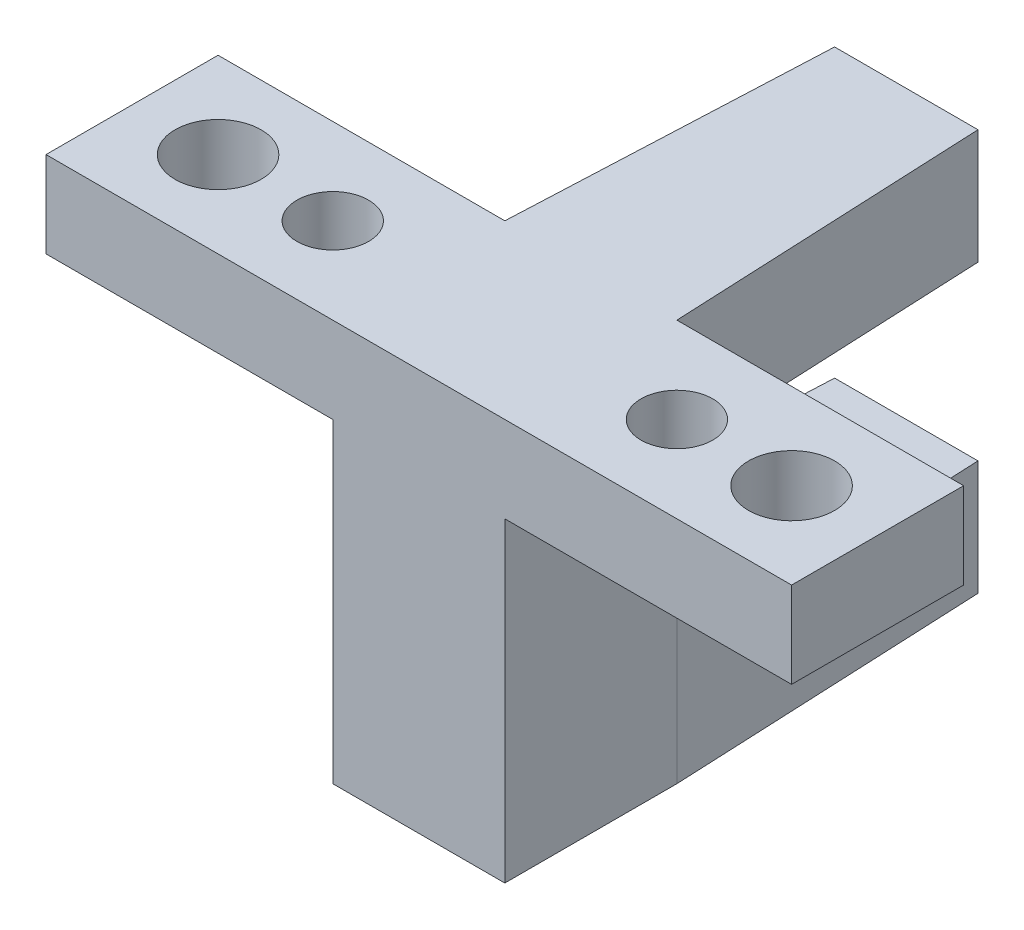
ISO-10303-21;
HEADER;
FILE_DESCRIPTION(('STEP AP214'),'2;1');
FILE_NAME('part.step','',(''),(''),'','','');
FILE_SCHEMA(('AUTOMOTIVE_DESIGN { 1 0 10303 214 1 1 1 1 }'));
ENDSEC;
DATA;
#1=APPLICATION_CONTEXT('core data for automotive mechanical design processes');
#2=APPLICATION_PROTOCOL_DEFINITION('international standard','automotive_design',2000,#1);
#3=PRODUCT_CONTEXT('',#1,'mechanical');
#4=PRODUCT('Part','Part','',(#3));
#5=PRODUCT_RELATED_PRODUCT_CATEGORY('part','',(#4));
#6=PRODUCT_DEFINITION_FORMATION('','',#4);
#7=PRODUCT_DEFINITION_CONTEXT('part definition',#1,'design');
#8=PRODUCT_DEFINITION('design','',#6,#7);
#9=PRODUCT_DEFINITION_SHAPE('','',#8);
#10=(LENGTH_UNIT() NAMED_UNIT(*) SI_UNIT(.MILLI.,.METRE.));
#11=(NAMED_UNIT(*) PLANE_ANGLE_UNIT() SI_UNIT($,.RADIAN.));
#12=(NAMED_UNIT(*) SI_UNIT($,.STERADIAN.) SOLID_ANGLE_UNIT());
#13=UNCERTAINTY_MEASURE_WITH_UNIT(LENGTH_MEASURE(1.E-05),#10,'distance_accuracy_value','');
#14=(GEOMETRIC_REPRESENTATION_CONTEXT(3) GLOBAL_UNCERTAINTY_ASSIGNED_CONTEXT((#13)) GLOBAL_UNIT_ASSIGNED_CONTEXT((#10,
#11,#12)) REPRESENTATION_CONTEXT('',''));
#15=CARTESIAN_POINT('',(0.,0.,0.));
#16=DIRECTION('',(0.,0.,1.));
#17=DIRECTION('',(1.,0.,0.));
#18=AXIS2_PLACEMENT_3D('',#15,#16,#17);
#19=CARTESIAN_POINT('',(0.,0.,0.));
#20=DIRECTION('',(0.,1.,0.));
#21=DIRECTION('',(0.,0.,1.));
#22=AXIS2_PLACEMENT_3D('',#19,#20,#21);
#23=PLANE('',#22);
#24=CARTESIAN_POINT('',(-6.,0.,0.));
#25=DIRECTION('',(0.,1.,0.));
#26=DIRECTION('',(0.,0.,1.));
#27=AXIS2_PLACEMENT_3D('',#24,#25,#26);
#28=CIRCLE('',#27,1.25);
#29=CARTESIAN_POINT('',(-6.,0.,1.25));
#30=VERTEX_POINT('',#29);
#31=EDGE_CURVE('E251',#30,#30,#28,.T.);
#32=ORIENTED_EDGE('',*,*,#31,.T.);
#33=EDGE_LOOP('',(#32));
#34=FACE_BOUND('',#33,.T.);
#35=CARTESIAN_POINT('',(-10.,0.,0.));
#36=DIRECTION('',(0.,1.,0.));
#37=DIRECTION('',(0.,0.,1.));
#38=AXIS2_PLACEMENT_3D('',#35,#36,#37);
#39=CIRCLE('',#38,1.5);
#40=CARTESIAN_POINT('',(-10.,0.,1.5));
#41=VERTEX_POINT('',#40);
#42=EDGE_CURVE('E257',#41,#41,#39,.T.);
#43=ORIENTED_EDGE('',*,*,#42,.T.);
#44=EDGE_LOOP('',(#43));
#45=FACE_BOUND('',#44,.T.);
#46=DIRECTION('',(0.,0.,-1.));
#47=VECTOR('',#46,1.);
#48=CARTESIAN_POINT('',(-3.,0.,0.));
#49=LINE('',#48,#47);
#50=CARTESIAN_POINT('',(-3.,0.,3.));
#51=VERTEX_POINT('',#50);
#52=CARTESIAN_POINT('',(-3.,0.,-3.));
#53=VERTEX_POINT('',#52);
#54=EDGE_CURVE('E196',#51,#53,#49,.T.);
#55=ORIENTED_EDGE('',*,*,#54,.F.);
#56=DIRECTION('',(1.,0.,0.));
#57=VECTOR('',#56,1.);
#58=CARTESIAN_POINT('',(-13.,0.,3.));
#59=LINE('',#58,#57);
#60=CARTESIAN_POINT('',(-13.,0.,3.));
#61=VERTEX_POINT('',#60);
#62=EDGE_CURVE('E269',#61,#51,#59,.T.);
#63=ORIENTED_EDGE('',*,*,#62,.F.);
#64=DIRECTION('',(0.,0.,1.));
#65=VECTOR('',#64,1.);
#66=CARTESIAN_POINT('',(-13.,0.,-3.));
#67=LINE('',#66,#65);
#68=CARTESIAN_POINT('',(-13.,0.,-3.));
#69=VERTEX_POINT('',#68);
#70=EDGE_CURVE('E281',#69,#61,#67,.T.);
#71=ORIENTED_EDGE('',*,*,#70,.F.);
#72=DIRECTION('',(-1.,0.,0.));
#73=VECTOR('',#72,1.);
#74=CARTESIAN_POINT('',(-13.,0.,-3.));
#75=LINE('',#74,#73);
#76=EDGE_CURVE('E277',#53,#69,#75,.T.);
#77=ORIENTED_EDGE('',*,*,#76,.F.);
#78=EDGE_LOOP('',(#55,#63,#71,#77));
#79=FACE_BOUND('',#78,.T.);
#80=ADVANCED_FACE('F42',(#34,#45,#79),#23,.F.);
#81=CARTESIAN_POINT('',(0.,-1.,0.));
#82=DIRECTION('',(0.,1.,0.));
#83=DIRECTION('',(0.,0.,1.));
#84=AXIS2_PLACEMENT_3D('',#81,#82,#83);
#85=PLANE('',#84);
#86=DIRECTION('',(1.,0.,0.));
#87=VECTOR('',#86,1.);
#88=CARTESIAN_POINT('',(0.,-1.,-7.));
#89=LINE('',#88,#87);
#90=CARTESIAN_POINT('',(-2.81818181818182,-1.,-7.));
#91=VERTEX_POINT('',#90);
#92=CARTESIAN_POINT('',(2.81818181818182,-1.,-7.));
#93=VERTEX_POINT('',#92);
#94=EDGE_CURVE('E11',#91,#93,#89,.T.);
#95=ORIENTED_EDGE('',*,*,#94,.F.);
#96=DIRECTION('',(-0.0454076609186497,0.,0.9989685402103));
#97=VECTOR('',#96,1.);
#98=CARTESIAN_POINT('',(-3.12989690721649,-1.,-0.142268041237112));
#99=LINE('',#98,#97);
#100=CARTESIAN_POINT('',(-2.5,-1.,-14.));
#101=VERTEX_POINT('',#100);
#102=EDGE_CURVE('E220',#101,#91,#99,.T.);
#103=ORIENTED_EDGE('',*,*,#102,.F.);
#104=DIRECTION('',(1.,0.,0.));
#105=VECTOR('',#104,1.);
#106=CARTESIAN_POINT('',(0.,-1.,-14.));
#107=LINE('',#106,#105);
#108=CARTESIAN_POINT('',(2.5,-1.,-14.));
#109=VERTEX_POINT('',#108);
#110=EDGE_CURVE('E217',#101,#109,#107,.T.);
#111=ORIENTED_EDGE('',*,*,#110,.T.);
#112=DIRECTION('',(0.04540766091865,0.,0.9989685402103));
#113=VECTOR('',#112,1.);
#114=CARTESIAN_POINT('',(3.1298969072165,-1.,-0.142268041237114));
#115=LINE('',#114,#113);
#116=EDGE_CURVE('E222',#109,#93,#115,.T.);
#117=ORIENTED_EDGE('',*,*,#116,.T.);
#118=EDGE_LOOP('',(#95,#103,#111,#117));
#119=FACE_BOUND('',#118,.T.);
#120=ADVANCED_FACE('F321',(#119),#85,.F.);
#121=CARTESIAN_POINT('',(-13.,3.,-3.));
#122=DIRECTION('',(0.,0.,1.));
#123=DIRECTION('',(1.,0.,0.));
#124=AXIS2_PLACEMENT_3D('',#121,#122,#123);
#125=PLANE('',#124);
#126=DIRECTION('',(0.,1.,0.));
#127=VECTOR('',#126,1.);
#128=CARTESIAN_POINT('',(-3.,-1.,-3.));
#129=LINE('',#128,#127);
#130=CARTESIAN_POINT('',(-3.,3.,-3.));
#131=VERTEX_POINT('',#130);
#132=EDGE_CURVE('E50',#53,#131,#129,.T.);
#133=ORIENTED_EDGE('',*,*,#132,.F.);
#134=ORIENTED_EDGE('',*,*,#76,.T.);
#135=DIRECTION('',(0.,-1.,0.));
#136=VECTOR('',#135,1.);
#137=CARTESIAN_POINT('',(-13.,3.,-3.));
#138=LINE('',#137,#136);
#139=CARTESIAN_POINT('',(-13.,3.,-3.));
#140=VERTEX_POINT('',#139);
#141=EDGE_CURVE('E289',#140,#69,#138,.T.);
#142=ORIENTED_EDGE('',*,*,#141,.F.);
#143=DIRECTION('',(-1.,0.,0.));
#144=VECTOR('',#143,1.);
#145=CARTESIAN_POINT('',(-13.,3.,-3.));
#146=LINE('',#145,#144);
#147=EDGE_CURVE('E268',#131,#140,#146,.T.);
#148=ORIENTED_EDGE('',*,*,#147,.F.);
#149=EDGE_LOOP('',(#133,#134,#142,#148));
#150=FACE_BOUND('',#149,.T.);
#151=ADVANCED_FACE('F302',(#150),#125,.F.);
#152=CARTESIAN_POINT('',(0.,3.,0.));
#153=DIRECTION('',(0.,1.,0.));
#154=DIRECTION('',(0.,0.,1.));
#155=AXIS2_PLACEMENT_3D('',#152,#153,#154);
#156=PLANE('',#155);
#157=CARTESIAN_POINT('',(10.,3.,0.));
#158=DIRECTION('',(0.,1.,0.));
#159=DIRECTION('',(0.,0.,1.));
#160=AXIS2_PLACEMENT_3D('',#157,#158,#159);
#161=CIRCLE('',#160,1.5);
#162=CARTESIAN_POINT('',(10.,3.,1.5));
#163=VERTEX_POINT('',#162);
#164=EDGE_CURVE('E248',#163,#163,#161,.T.);
#165=ORIENTED_EDGE('',*,*,#164,.F.);
#166=EDGE_LOOP('',(#165));
#167=FACE_BOUND('',#166,.T.);
#168=CARTESIAN_POINT('',(-10.,3.,0.));
#169=DIRECTION('',(0.,1.,0.));
#170=DIRECTION('',(0.,0.,1.));
#171=AXIS2_PLACEMENT_3D('',#168,#169,#170);
#172=CIRCLE('',#171,1.5);
#173=CARTESIAN_POINT('',(-10.,3.,1.5));
#174=VERTEX_POINT('',#173);
#175=EDGE_CURVE('E260',#174,#174,#172,.T.);
#176=ORIENTED_EDGE('',*,*,#175,.F.);
#177=EDGE_LOOP('',(#176));
#178=FACE_BOUND('',#177,.T.);
#179=DIRECTION('',(0.,0.,-1.));
#180=VECTOR('',#179,1.);
#181=CARTESIAN_POINT('',(13.,3.,-3.));
#182=LINE('',#181,#180);
#183=CARTESIAN_POINT('',(13.,3.,3.00000000000001));
#184=VERTEX_POINT('',#183);
#185=CARTESIAN_POINT('',(13.,3.,-3.));
#186=VERTEX_POINT('',#185);
#187=EDGE_CURVE('E266',#184,#186,#182,.T.);
#188=ORIENTED_EDGE('',*,*,#187,.T.);
#189=CARTESIAN_POINT('',(3.,3.,-3.));
#190=VERTEX_POINT('',#189);
#191=EDGE_CURVE('E94',#186,#190,#146,.T.);
#192=ORIENTED_EDGE('',*,*,#191,.T.);
#193=DIRECTION('',(0.04540766091865,0.,0.9989685402103));
#194=VECTOR('',#193,1.);
#195=CARTESIAN_POINT('',(3.1298969072165,3.,-0.142268041237114));
#196=LINE('',#195,#194);
#197=CARTESIAN_POINT('',(2.5,3.,-14.));
#198=VERTEX_POINT('',#197);
#199=EDGE_CURVE('E57',#198,#190,#196,.T.);
#200=ORIENTED_EDGE('',*,*,#199,.F.);
#201=DIRECTION('',(1.,0.,0.));
#202=VECTOR('',#201,1.);
#203=CARTESIAN_POINT('',(0.,3.,-14.));
#204=LINE('',#203,#202);
#205=CARTESIAN_POINT('',(-2.5,3.,-14.));
#206=VERTEX_POINT('',#205);
#207=EDGE_CURVE('E216',#206,#198,#204,.T.);
#208=ORIENTED_EDGE('',*,*,#207,.F.);
#209=DIRECTION('',(-0.0454076609186497,0.,0.9989685402103));
#210=VECTOR('',#209,1.);
#211=CARTESIAN_POINT('',(-3.12989690721649,3.,-0.142268041237112));
#212=LINE('',#211,#210);
#213=EDGE_CURVE('E228',#206,#131,#212,.T.);
#214=ORIENTED_EDGE('',*,*,#213,.T.);
#215=ORIENTED_EDGE('',*,*,#147,.T.);
#216=DIRECTION('',(0.,0.,1.));
#217=VECTOR('',#216,1.);
#218=CARTESIAN_POINT('',(-13.,3.,-3.));
#219=LINE('',#218,#217);
#220=CARTESIAN_POINT('',(-13.,3.,3.));
#221=VERTEX_POINT('',#220);
#222=EDGE_CURVE('E271',#140,#221,#219,.T.);
#223=ORIENTED_EDGE('',*,*,#222,.T.);
#224=DIRECTION('',(1.,0.,0.));
#225=VECTOR('',#224,1.);
#226=CARTESIAN_POINT('',(-13.,3.,3.));
#227=LINE('',#226,#225);
#228=EDGE_CURVE('E66',#221,#184,#227,.T.);
#229=ORIENTED_EDGE('',*,*,#228,.T.);
#230=EDGE_LOOP('',(#188,#192,#200,#208,#214,#215,#223,#229));
#231=FACE_BOUND('',#230,.T.);
#232=CARTESIAN_POINT('',(-6.,3.,0.));
#233=DIRECTION('',(0.,1.,0.));
#234=DIRECTION('',(0.,0.,1.));
#235=AXIS2_PLACEMENT_3D('',#232,#233,#234);
#236=CIRCLE('',#235,1.25);
#237=CARTESIAN_POINT('',(-6.,3.,1.25));
#238=VERTEX_POINT('',#237);
#239=EDGE_CURVE('E254',#238,#238,#236,.T.);
#240=ORIENTED_EDGE('',*,*,#239,.F.);
#241=EDGE_LOOP('',(#240));
#242=FACE_BOUND('',#241,.T.);
#243=CARTESIAN_POINT('',(6.,3.,0.));
#244=DIRECTION('',(0.,1.,0.));
#245=DIRECTION('',(0.,0.,1.));
#246=AXIS2_PLACEMENT_3D('',#243,#244,#245);
#247=CIRCLE('',#246,1.25);
#248=CARTESIAN_POINT('',(6.,3.,1.25));
#249=VERTEX_POINT('',#248);
#250=EDGE_CURVE('E242',#249,#249,#247,.T.);
#251=ORIENTED_EDGE('',*,*,#250,.F.);
#252=EDGE_LOOP('',(#251));
#253=FACE_BOUND('',#252,.T.);
#254=ADVANCED_FACE('F299',(#167,#178,#231,#242,#253),#156,.T.);
#255=CARTESIAN_POINT('',(3.,0.,3.));
#256=VERTEX_POINT('',#255);
#257=CARTESIAN_POINT('',(13.,0.,3.00000000000001));
#258=VERTEX_POINT('',#257);
#259=EDGE_CURVE('E87',#256,#258,#59,.T.);
#260=ORIENTED_EDGE('',*,*,#259,.F.);
#261=DIRECTION('',(0.,0.,-1.));
#262=VECTOR('',#261,1.);
#263=CARTESIAN_POINT('',(3.,0.,0.));
#264=LINE('',#263,#262);
#265=CARTESIAN_POINT('',(3.,0.,-3.));
#266=VERTEX_POINT('',#265);
#267=EDGE_CURVE('E190',#256,#266,#264,.T.);
#268=ORIENTED_EDGE('',*,*,#267,.T.);
#269=CARTESIAN_POINT('',(13.,0.,-3.));
#270=VERTEX_POINT('',#269);
#271=EDGE_CURVE('E278',#270,#266,#75,.T.);
#272=ORIENTED_EDGE('',*,*,#271,.F.);
#273=DIRECTION('',(0.,0.,-1.));
#274=VECTOR('',#273,1.);
#275=CARTESIAN_POINT('',(13.,0.,-3.));
#276=LINE('',#275,#274);
#277=EDGE_CURVE('E263',#258,#270,#276,.T.);
#278=ORIENTED_EDGE('',*,*,#277,.F.);
#279=EDGE_LOOP('',(#260,#268,#272,#278));
#280=FACE_BOUND('',#279,.T.);
#281=CARTESIAN_POINT('',(10.,0.,0.));
#282=DIRECTION('',(0.,1.,0.));
#283=DIRECTION('',(0.,0.,1.));
#284=AXIS2_PLACEMENT_3D('',#281,#282,#283);
#285=CIRCLE('',#284,1.5);
#286=CARTESIAN_POINT('',(10.,0.,1.5));
#287=VERTEX_POINT('',#286);
#288=EDGE_CURVE('E245',#287,#287,#285,.T.);
#289=ORIENTED_EDGE('',*,*,#288,.T.);
#290=EDGE_LOOP('',(#289));
#291=FACE_BOUND('',#290,.T.);
#292=CARTESIAN_POINT('',(6.,0.,0.));
#293=DIRECTION('',(0.,1.,0.));
#294=DIRECTION('',(0.,0.,1.));
#295=AXIS2_PLACEMENT_3D('',#292,#293,#294);
#296=CIRCLE('',#295,1.25);
#297=CARTESIAN_POINT('',(6.,0.,1.25));
#298=VERTEX_POINT('',#297);
#299=EDGE_CURVE('E234',#298,#298,#296,.T.);
#300=ORIENTED_EDGE('',*,*,#299,.T.);
#301=EDGE_LOOP('',(#300));
#302=FACE_BOUND('',#301,.T.);
#303=ADVANCED_FACE('F339',(#280,#291,#302),#23,.F.);
#304=CARTESIAN_POINT('',(13.,3.,-3.));
#305=DIRECTION('',(-1.,0.,0.));
#306=DIRECTION('',(0.,0.,1.));
#307=AXIS2_PLACEMENT_3D('',#304,#305,#306);
#308=PLANE('',#307);
#309=ORIENTED_EDGE('',*,*,#277,.T.);
#310=DIRECTION('',(0.,-1.,0.));
#311=VECTOR('',#310,1.);
#312=CARTESIAN_POINT('',(13.,3.,-3.));
#313=LINE('',#312,#311);
#314=EDGE_CURVE('E291',#186,#270,#313,.T.);
#315=ORIENTED_EDGE('',*,*,#314,.F.);
#316=ORIENTED_EDGE('',*,*,#187,.F.);
#317=DIRECTION('',(0.,-1.,0.));
#318=VECTOR('',#317,1.);
#319=CARTESIAN_POINT('',(13.,3.,3.00000000000001));
#320=LINE('',#319,#318);
#321=EDGE_CURVE('E274',#184,#258,#320,.T.);
#322=ORIENTED_EDGE('',*,*,#321,.T.);
#323=EDGE_LOOP('',(#309,#315,#316,#322));
#324=FACE_BOUND('',#323,.T.);
#325=ADVANCED_FACE('F44',(#324),#308,.F.);
#326=ORIENTED_EDGE('',*,*,#271,.T.);
#327=DIRECTION('',(0.,1.,0.));
#328=VECTOR('',#327,1.);
#329=CARTESIAN_POINT('',(3.,-1.,-3.));
#330=LINE('',#329,#328);
#331=EDGE_CURVE('E238',#266,#190,#330,.T.);
#332=ORIENTED_EDGE('',*,*,#331,.T.);
#333=ORIENTED_EDGE('',*,*,#191,.F.);
#334=ORIENTED_EDGE('',*,*,#314,.T.);
#335=EDGE_LOOP('',(#326,#332,#333,#334));
#336=FACE_BOUND('',#335,.T.);
#337=ADVANCED_FACE('F341',(#336),#125,.F.);
#338=CARTESIAN_POINT('',(-13.,3.,-3.));
#339=DIRECTION('',(1.,0.,0.));
#340=DIRECTION('',(0.,0.,-1.));
#341=AXIS2_PLACEMENT_3D('',#338,#339,#340);
#342=PLANE('',#341);
#343=ORIENTED_EDGE('',*,*,#70,.T.);
#344=DIRECTION('',(0.,-1.,0.));
#345=VECTOR('',#344,1.);
#346=CARTESIAN_POINT('',(-13.,3.,3.));
#347=LINE('',#346,#345);
#348=EDGE_CURVE('E286',#221,#61,#347,.T.);
#349=ORIENTED_EDGE('',*,*,#348,.F.);
#350=ORIENTED_EDGE('',*,*,#222,.F.);
#351=ORIENTED_EDGE('',*,*,#141,.T.);
#352=EDGE_LOOP('',(#343,#349,#350,#351));
#353=FACE_BOUND('',#352,.T.);
#354=ADVANCED_FACE('F307',(#353),#342,.F.);
#355=CARTESIAN_POINT('',(-13.,3.,3.));
#356=DIRECTION('',(0.,0.,-1.));
#357=DIRECTION('',(-1.,0.,0.));
#358=AXIS2_PLACEMENT_3D('',#355,#356,#357);
#359=PLANE('',#358);
#360=ORIENTED_EDGE('',*,*,#62,.T.);
#361=DIRECTION('',(0.,1.,0.));
#362=VECTOR('',#361,1.);
#363=CARTESIAN_POINT('',(-3.,-11.,3.));
#364=LINE('',#363,#362);
#365=CARTESIAN_POINT('',(-3.,-11.,3.));
#366=VERTEX_POINT('',#365);
#367=EDGE_CURVE('E210',#366,#51,#364,.T.);
#368=ORIENTED_EDGE('',*,*,#367,.F.);
#369=DIRECTION('',(-1.,0.,0.));
#370=VECTOR('',#369,1.);
#371=CARTESIAN_POINT('',(0.,-11.,3.));
#372=LINE('',#371,#370);
#373=CARTESIAN_POINT('',(3.,-11.,3.));
#374=VERTEX_POINT('',#373);
#375=EDGE_CURVE('E199',#374,#366,#372,.T.);
#376=ORIENTED_EDGE('',*,*,#375,.F.);
#377=DIRECTION('',(0.,1.,0.));
#378=VECTOR('',#377,1.);
#379=CARTESIAN_POINT('',(3.,-11.,3.));
#380=LINE('',#379,#378);
#381=EDGE_CURVE('E212',#374,#256,#380,.T.);
#382=ORIENTED_EDGE('',*,*,#381,.T.);
#383=ORIENTED_EDGE('',*,*,#259,.T.);
#384=ORIENTED_EDGE('',*,*,#321,.F.);
#385=ORIENTED_EDGE('',*,*,#228,.F.);
#386=ORIENTED_EDGE('',*,*,#348,.T.);
#387=EDGE_LOOP('',(#360,#368,#376,#382,#383,#384,#385,#386));
#388=FACE_BOUND('',#387,.T.);
#389=ADVANCED_FACE('F309',(#388),#359,.F.);
#390=CARTESIAN_POINT('',(-10.,3.,0.));
#391=DIRECTION('',(0.,-1.,0.));
#392=DIRECTION('',(0.,0.,-1.));
#393=AXIS2_PLACEMENT_3D('',#390,#391,#392);
#394=CYLINDRICAL_SURFACE('',#393,1.5);
#395=ORIENTED_EDGE('',*,*,#175,.T.);
#396=EDGE_LOOP('',(#395));
#397=FACE_BOUND('',#396,.T.);
#398=ORIENTED_EDGE('',*,*,#42,.F.);
#399=EDGE_LOOP('',(#398));
#400=FACE_BOUND('',#399,.T.);
#401=ADVANCED_FACE('F369',(#397,#400),#394,.F.);
#402=CARTESIAN_POINT('',(-6.,3.,0.));
#403=DIRECTION('',(0.,-1.,0.));
#404=DIRECTION('',(0.,0.,-1.));
#405=AXIS2_PLACEMENT_3D('',#402,#403,#404);
#406=CYLINDRICAL_SURFACE('',#405,1.25);
#407=ORIENTED_EDGE('',*,*,#239,.T.);
#408=EDGE_LOOP('',(#407));
#409=FACE_BOUND('',#408,.T.);
#410=ORIENTED_EDGE('',*,*,#31,.F.);
#411=EDGE_LOOP('',(#410));
#412=FACE_BOUND('',#411,.T.);
#413=ADVANCED_FACE('F372',(#409,#412),#406,.F.);
#414=CARTESIAN_POINT('',(10.,3.,0.));
#415=DIRECTION('',(0.,-1.,0.));
#416=DIRECTION('',(0.,0.,-1.));
#417=AXIS2_PLACEMENT_3D('',#414,#415,#416);
#418=CYLINDRICAL_SURFACE('',#417,1.5);
#419=ORIENTED_EDGE('',*,*,#164,.T.);
#420=EDGE_LOOP('',(#419));
#421=FACE_BOUND('',#420,.T.);
#422=ORIENTED_EDGE('',*,*,#288,.F.);
#423=EDGE_LOOP('',(#422));
#424=FACE_BOUND('',#423,.T.);
#425=ADVANCED_FACE('F376',(#421,#424),#418,.F.);
#426=CARTESIAN_POINT('',(6.,3.,0.));
#427=DIRECTION('',(0.,-1.,0.));
#428=DIRECTION('',(0.,0.,-1.));
#429=AXIS2_PLACEMENT_3D('',#426,#427,#428);
#430=CYLINDRICAL_SURFACE('',#429,1.25);
#431=ORIENTED_EDGE('',*,*,#250,.T.);
#432=EDGE_LOOP('',(#431));
#433=FACE_BOUND('',#432,.T.);
#434=ORIENTED_EDGE('',*,*,#299,.F.);
#435=EDGE_LOOP('',(#434));
#436=FACE_BOUND('',#435,.T.);
#437=ADVANCED_FACE('F380',(#433,#436),#430,.F.);
#438=CARTESIAN_POINT('',(0.,-1.,-14.));
#439=DIRECTION('',(0.,0.,1.));
#440=DIRECTION('',(1.,0.,0.));
#441=AXIS2_PLACEMENT_3D('',#438,#439,#440);
#442=PLANE('',#441);
#443=ORIENTED_EDGE('',*,*,#207,.T.);
#444=DIRECTION('',(0.,1.,0.));
#445=VECTOR('',#444,1.);
#446=CARTESIAN_POINT('',(2.5,-1.,-14.));
#447=LINE('',#446,#445);
#448=EDGE_CURVE('E232',#109,#198,#447,.T.);
#449=ORIENTED_EDGE('',*,*,#448,.F.);
#450=ORIENTED_EDGE('',*,*,#110,.F.);
#451=DIRECTION('',(0.,1.,0.));
#452=VECTOR('',#451,1.);
#453=CARTESIAN_POINT('',(-2.5,-1.,-14.));
#454=LINE('',#453,#452);
#455=EDGE_CURVE('E225',#101,#206,#454,.T.);
#456=ORIENTED_EDGE('',*,*,#455,.T.);
#457=EDGE_LOOP('',(#443,#449,#450,#456));
#458=FACE_BOUND('',#457,.T.);
#459=ADVANCED_FACE('F317',(#458),#442,.F.);
#460=CARTESIAN_POINT('',(3.1298969072165,-1.,-0.142268041237114));
#461=DIRECTION('',(-0.998968540210299,0.,0.04540766091865));
#462=DIRECTION('',(0.04540766091865,0.,0.9989685402103));
#463=AXIS2_PLACEMENT_3D('',#460,#461,#462);
#464=PLANE('',#463);
#465=CARTESIAN_POINT('',(3.,-11.,-3.));
#466=VERTEX_POINT('',#465);
#467=EDGE_CURVE('E235',#466,#266,#330,.T.);
#468=ORIENTED_EDGE('',*,*,#467,.F.);
#469=DIRECTION('',(0.0454076609186497,0.,0.9989685402103));
#470=VECTOR('',#469,1.);
#471=CARTESIAN_POINT('',(3.12989690721649,-11.,-0.142268041237112));
#472=LINE('',#471,#470);
#473=CARTESIAN_POINT('',(2.5,-11.,-14.));
#474=VERTEX_POINT('',#473);
#475=EDGE_CURVE('E192',#474,#466,#472,.T.);
#476=ORIENTED_EDGE('',*,*,#475,.F.);
#477=DIRECTION('',(0.,-1.,0.));
#478=VECTOR('',#477,1.);
#479=CARTESIAN_POINT('',(2.5,-7.,-14.));
#480=LINE('',#479,#478);
#481=CARTESIAN_POINT('',(2.5,-7.,-14.));
#482=VERTEX_POINT('',#481);
#483=EDGE_CURVE('E170',#482,#474,#480,.T.);
#484=ORIENTED_EDGE('',*,*,#483,.F.);
#485=DIRECTION('',(0.04540766091865,0.,0.9989685402103));
#486=VECTOR('',#485,1.);
#487=CARTESIAN_POINT('',(2.5,-7.,-14.));
#488=LINE('',#487,#486);
#489=CARTESIAN_POINT('',(2.81818181818182,-7.,-7.));
#490=VERTEX_POINT('',#489);
#491=EDGE_CURVE('E179',#482,#490,#488,.T.);
#492=ORIENTED_EDGE('',*,*,#491,.T.);
#493=DIRECTION('',(0.,1.,0.));
#494=VECTOR('',#493,1.);
#495=CARTESIAN_POINT('',(2.81818181818182,-11.,-7.));
#496=LINE('',#495,#494);
#497=EDGE_CURVE('E214',#490,#93,#496,.T.);
#498=ORIENTED_EDGE('',*,*,#497,.T.);
#499=ORIENTED_EDGE('',*,*,#116,.F.);
#500=ORIENTED_EDGE('',*,*,#448,.T.);
#501=ORIENTED_EDGE('',*,*,#199,.T.);
#502=ORIENTED_EDGE('',*,*,#331,.F.);
#503=EDGE_LOOP('',(#468,#476,#484,#492,#498,#499,#500,#501,#502));
#504=FACE_BOUND('',#503,.T.);
#505=ADVANCED_FACE('F314',(#504),#464,.F.);
#506=CARTESIAN_POINT('',(-3.12989690721649,-1.,-0.142268041237112));
#507=DIRECTION('',(-0.9989685402103,0.,-0.0454076609186497));
#508=DIRECTION('',(-0.0454076609186497,0.,0.9989685402103));
#509=AXIS2_PLACEMENT_3D('',#506,#507,#508);
#510=PLANE('',#509);
#511=ORIENTED_EDGE('',*,*,#102,.T.);
#512=DIRECTION('',(0.,1.,0.));
#513=VECTOR('',#512,1.);
#514=CARTESIAN_POINT('',(-2.81818181818182,-11.,-7.));
#515=LINE('',#514,#513);
#516=CARTESIAN_POINT('',(-2.81818181818182,-7.,-7.));
#517=VERTEX_POINT('',#516);
#518=EDGE_CURVE('E184',#517,#91,#515,.T.);
#519=ORIENTED_EDGE('',*,*,#518,.F.);
#520=DIRECTION('',(0.0454076609186497,0.,-0.9989685402103));
#521=VECTOR('',#520,1.);
#522=CARTESIAN_POINT('',(-2.5,-7.,-14.));
#523=LINE('',#522,#521);
#524=CARTESIAN_POINT('',(-2.5,-7.,-14.));
#525=VERTEX_POINT('',#524);
#526=EDGE_CURVE('E177',#517,#525,#523,.T.);
#527=ORIENTED_EDGE('',*,*,#526,.T.);
#528=DIRECTION('',(0.,-1.,0.));
#529=VECTOR('',#528,1.);
#530=CARTESIAN_POINT('',(-2.5,-7.,-14.));
#531=LINE('',#530,#529);
#532=CARTESIAN_POINT('',(-2.5,-11.,-14.));
#533=VERTEX_POINT('',#532);
#534=EDGE_CURVE('E160',#525,#533,#531,.T.);
#535=ORIENTED_EDGE('',*,*,#534,.T.);
#536=DIRECTION('',(-0.0454076609186507,0.,0.9989685402103));
#537=VECTOR('',#536,1.);
#538=CARTESIAN_POINT('',(-3.1298969072165,-11.,-0.142268041237116));
#539=LINE('',#538,#537);
#540=CARTESIAN_POINT('',(-3.,-11.,-3.));
#541=VERTEX_POINT('',#540);
#542=EDGE_CURVE('E204',#533,#541,#539,.T.);
#543=ORIENTED_EDGE('',*,*,#542,.T.);
#544=EDGE_CURVE('E237',#541,#53,#129,.T.);
#545=ORIENTED_EDGE('',*,*,#544,.T.);
#546=ORIENTED_EDGE('',*,*,#132,.T.);
#547=ORIENTED_EDGE('',*,*,#213,.F.);
#548=ORIENTED_EDGE('',*,*,#455,.F.);
#549=EDGE_LOOP('',(#511,#519,#527,#535,#543,#545,#546,#547,#548));
#550=FACE_BOUND('',#549,.T.);
#551=ADVANCED_FACE('F183',(#550),#510,.T.);
#552=CARTESIAN_POINT('',(0.,-11.,-7.));
#553=DIRECTION('',(0.,0.,1.));
#554=DIRECTION('',(1.,0.,0.));
#555=AXIS2_PLACEMENT_3D('',#552,#553,#554);
#556=PLANE('',#555);
#557=ORIENTED_EDGE('',*,*,#497,.F.);
#558=DIRECTION('',(-1.,0.,0.));
#559=VECTOR('',#558,1.);
#560=CARTESIAN_POINT('',(-2.81818181818182,-7.,-7.));
#561=LINE('',#560,#559);
#562=EDGE_CURVE('E171',#490,#517,#561,.T.);
#563=ORIENTED_EDGE('',*,*,#562,.T.);
#564=ORIENTED_EDGE('',*,*,#518,.T.);
#565=ORIENTED_EDGE('',*,*,#94,.T.);
#566=EDGE_LOOP('',(#557,#563,#564,#565));
#567=FACE_BOUND('',#566,.T.);
#568=ADVANCED_FACE('F324',(#567),#556,.F.);
#569=CARTESIAN_POINT('',(3.,-11.,0.));
#570=DIRECTION('',(1.,0.,0.));
#571=DIRECTION('',(0.,0.,-1.));
#572=AXIS2_PLACEMENT_3D('',#569,#570,#571);
#573=PLANE('',#572);
#574=ORIENTED_EDGE('',*,*,#267,.F.);
#575=ORIENTED_EDGE('',*,*,#381,.F.);
#576=DIRECTION('',(0.,0.,-1.));
#577=VECTOR('',#576,1.);
#578=CARTESIAN_POINT('',(3.,-11.,0.));
#579=LINE('',#578,#577);
#580=EDGE_CURVE('E195',#374,#466,#579,.T.);
#581=ORIENTED_EDGE('',*,*,#580,.T.);
#582=ORIENTED_EDGE('',*,*,#467,.T.);
#583=EDGE_LOOP('',(#574,#575,#581,#582));
#584=FACE_BOUND('',#583,.T.);
#585=ADVANCED_FACE('F337',(#584),#573,.T.);
#586=CARTESIAN_POINT('',(-3.,-11.,0.));
#587=DIRECTION('',(1.,0.,0.));
#588=DIRECTION('',(0.,0.,-1.));
#589=AXIS2_PLACEMENT_3D('',#586,#587,#588);
#590=PLANE('',#589);
#591=ORIENTED_EDGE('',*,*,#54,.T.);
#592=ORIENTED_EDGE('',*,*,#544,.F.);
#593=DIRECTION('',(0.,0.,-1.));
#594=VECTOR('',#593,1.);
#595=CARTESIAN_POINT('',(-3.,-11.,0.));
#596=LINE('',#595,#594);
#597=EDGE_CURVE('E201',#366,#541,#596,.T.);
#598=ORIENTED_EDGE('',*,*,#597,.F.);
#599=ORIENTED_EDGE('',*,*,#367,.T.);
#600=EDGE_LOOP('',(#591,#592,#598,#599));
#601=FACE_BOUND('',#600,.T.);
#602=ADVANCED_FACE('F332',(#601),#590,.F.);
#603=CARTESIAN_POINT('',(0.,-11.,0.));
#604=DIRECTION('',(0.,-1.,0.));
#605=DIRECTION('',(0.,0.,-1.));
#606=AXIS2_PLACEMENT_3D('',#603,#604,#605);
#607=PLANE('',#606);
#608=ORIENTED_EDGE('',*,*,#542,.F.);
#609=DIRECTION('',(1.,0.,0.));
#610=VECTOR('',#609,1.);
#611=CARTESIAN_POINT('',(-2.5,-11.,-14.));
#612=LINE('',#611,#610);
#613=EDGE_CURVE('E166',#533,#474,#612,.T.);
#614=ORIENTED_EDGE('',*,*,#613,.T.);
#615=ORIENTED_EDGE('',*,*,#475,.T.);
#616=ORIENTED_EDGE('',*,*,#580,.F.);
#617=ORIENTED_EDGE('',*,*,#375,.T.);
#618=ORIENTED_EDGE('',*,*,#597,.T.);
#619=EDGE_LOOP('',(#608,#614,#615,#616,#617,#618));
#620=FACE_BOUND('',#619,.T.);
#621=ADVANCED_FACE('F326',(#620),#607,.T.);
#622=CARTESIAN_POINT('',(-2.5,-7.,-14.));
#623=DIRECTION('',(0.,0.,-1.));
#624=DIRECTION('',(-1.,0.,0.));
#625=AXIS2_PLACEMENT_3D('',#622,#623,#624);
#626=PLANE('',#625);
#627=ORIENTED_EDGE('',*,*,#613,.F.);
#628=ORIENTED_EDGE('',*,*,#534,.F.);
#629=DIRECTION('',(1.,0.,0.));
#630=VECTOR('',#629,1.);
#631=CARTESIAN_POINT('',(-2.5,-7.,-14.));
#632=LINE('',#631,#630);
#633=EDGE_CURVE('E164',#525,#482,#632,.T.);
#634=ORIENTED_EDGE('',*,*,#633,.T.);
#635=ORIENTED_EDGE('',*,*,#483,.T.);
#636=EDGE_LOOP('',(#627,#628,#634,#635));
#637=FACE_BOUND('',#636,.T.);
#638=ADVANCED_FACE('F162',(#637),#626,.T.);
#639=CARTESIAN_POINT('',(0.,-7.,0.));
#640=DIRECTION('',(0.,1.,0.));
#641=DIRECTION('',(0.,0.,1.));
#642=AXIS2_PLACEMENT_3D('',#639,#640,#641);
#643=PLANE('',#642);
#644=ORIENTED_EDGE('',*,*,#526,.F.);
#645=ORIENTED_EDGE('',*,*,#562,.F.);
#646=ORIENTED_EDGE('',*,*,#491,.F.);
#647=ORIENTED_EDGE('',*,*,#633,.F.);
#648=EDGE_LOOP('',(#644,#645,#646,#647));
#649=FACE_BOUND('',#648,.T.);
#650=ADVANCED_FACE('F175',(#649),#643,.T.);
#651=CLOSED_SHELL('',(#80,#120,#151,#254,#303,#325,#337,#354,#389,#401,#413,#425,#437,#459,#505,
#551,#568,#585,#602,#621,#638,#650));
#652=MANIFOLD_SOLID_BREP('B2',#651);
#653=ADVANCED_BREP_SHAPE_REPRESENTATION('',(#18,#652),#14);
#654=SHAPE_DEFINITION_REPRESENTATION(#9,#653);
ENDSEC;
END-ISO-10303-21;
